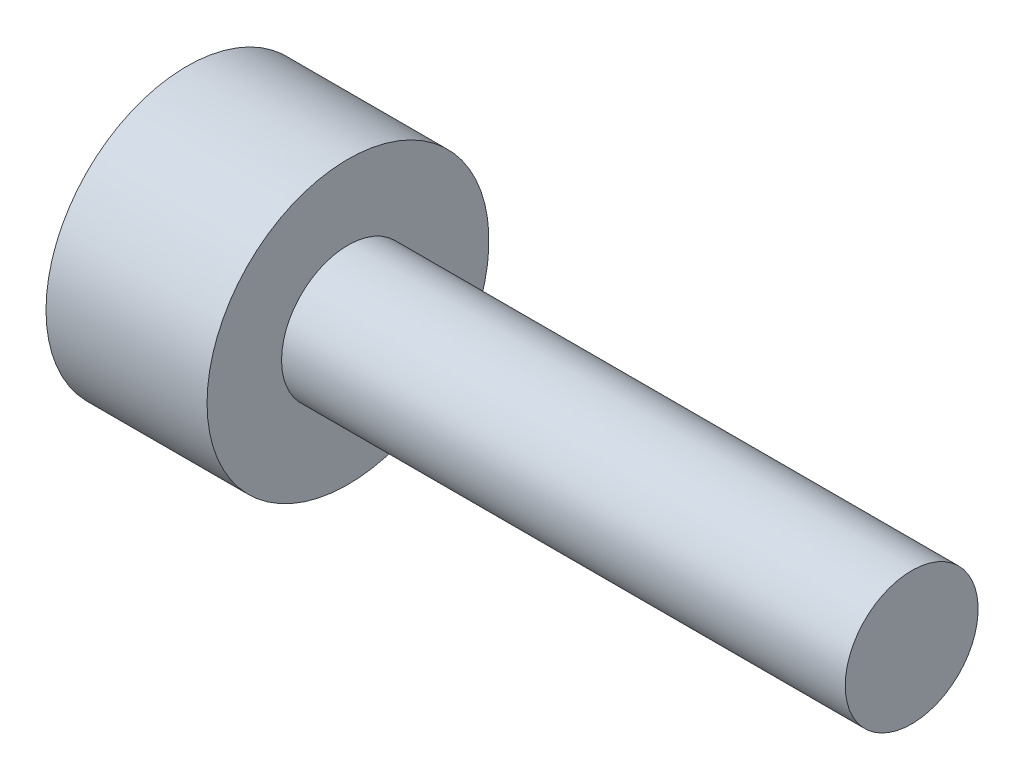
ISO-10303-21;
HEADER;
FILE_DESCRIPTION(('STEP AP214'),'2;1');
FILE_NAME('part.step','',(''),(''),'','','');
FILE_SCHEMA(('AUTOMOTIVE_DESIGN { 1 0 10303 214 1 1 1 1 }'));
ENDSEC;
DATA;
#1=APPLICATION_CONTEXT('core data for automotive mechanical design processes');
#2=APPLICATION_PROTOCOL_DEFINITION('international standard','automotive_design',2000,#1);
#3=PRODUCT_CONTEXT('',#1,'mechanical');
#4=PRODUCT('Part','Part','',(#3));
#5=PRODUCT_RELATED_PRODUCT_CATEGORY('part','',(#4));
#6=PRODUCT_DEFINITION_FORMATION('','',#4);
#7=PRODUCT_DEFINITION_CONTEXT('part definition',#1,'design');
#8=PRODUCT_DEFINITION('design','',#6,#7);
#9=PRODUCT_DEFINITION_SHAPE('','',#8);
#10=(LENGTH_UNIT() NAMED_UNIT(*) SI_UNIT(.MILLI.,.METRE.));
#11=(NAMED_UNIT(*) PLANE_ANGLE_UNIT() SI_UNIT($,.RADIAN.));
#12=(NAMED_UNIT(*) SI_UNIT($,.STERADIAN.) SOLID_ANGLE_UNIT());
#13=UNCERTAINTY_MEASURE_WITH_UNIT(LENGTH_MEASURE(1.E-05),#10,'distance_accuracy_value','');
#14=(GEOMETRIC_REPRESENTATION_CONTEXT(3) GLOBAL_UNCERTAINTY_ASSIGNED_CONTEXT((#13)) GLOBAL_UNIT_ASSIGNED_CONTEXT((#10,
#11,#12)) REPRESENTATION_CONTEXT('',''));
#15=CARTESIAN_POINT('',(0.,0.,0.));
#16=DIRECTION('',(0.,0.,1.));
#17=DIRECTION('',(1.,0.,0.));
#18=AXIS2_PLACEMENT_3D('',#15,#16,#17);
#19=CARTESIAN_POINT('',(-4.,0.,0.));
#20=DIRECTION('',(1.,0.,0.));
#21=DIRECTION('',(0.,0.,-1.));
#22=AXIS2_PLACEMENT_3D('',#19,#20,#21);
#23=PLANE('',#22);
#24=CARTESIAN_POINT('',(-4.,0.,0.));
#25=DIRECTION('',(-1.,0.,0.));
#26=DIRECTION('',(0.,0.,1.));
#27=AXIS2_PLACEMENT_3D('',#24,#25,#26);
#28=CIRCLE('',#27,3.5);
#29=CARTESIAN_POINT('',(-4.,0.,3.5));
#30=VERTEX_POINT('',#29);
#31=EDGE_CURVE('E11',#30,#30,#28,.T.);
#32=ORIENTED_EDGE('',*,*,#31,.T.);
#33=EDGE_LOOP('',(#32));
#34=FACE_BOUND('',#33,.T.);
#35=DIRECTION('',(0.,0.866025403784439,-0.5));
#36=VECTOR('',#35,1.);
#37=CARTESIAN_POINT('',(-4.,-1.5,-0.866025403784439));
#38=LINE('',#37,#36);
#39=CARTESIAN_POINT('',(-4.,-1.5,-0.866025403784439));
#40=VERTEX_POINT('',#39);
#41=CARTESIAN_POINT('',(-4.,0.,-1.73205080756888));
#42=VERTEX_POINT('',#41);
#43=EDGE_CURVE('E54',#40,#42,#38,.T.);
#44=ORIENTED_EDGE('',*,*,#43,.T.);
#45=DIRECTION('',(0.,0.866025403784439,0.5));
#46=VECTOR('',#45,1.);
#47=CARTESIAN_POINT('',(-4.,0.,-1.73205080756888));
#48=LINE('',#47,#46);
#49=CARTESIAN_POINT('',(-4.,1.5,-0.866025403784439));
#50=VERTEX_POINT('',#49);
#51=EDGE_CURVE('E126',#42,#50,#48,.T.);
#52=ORIENTED_EDGE('',*,*,#51,.T.);
#53=DIRECTION('',(0.,0.,1.));
#54=VECTOR('',#53,1.);
#55=CARTESIAN_POINT('',(-4.,1.5,-0.866025403784439));
#56=LINE('',#55,#54);
#57=CARTESIAN_POINT('',(-4.,1.5,0.866025403784438));
#58=VERTEX_POINT('',#57);
#59=EDGE_CURVE('E128',#50,#58,#56,.T.);
#60=ORIENTED_EDGE('',*,*,#59,.T.);
#61=DIRECTION('',(0.,-0.866025403784438,0.5));
#62=VECTOR('',#61,1.);
#63=CARTESIAN_POINT('',(-4.,1.5,0.866025403784438));
#64=LINE('',#63,#62);
#65=CARTESIAN_POINT('',(-4.,0.,1.73205080756888));
#66=VERTEX_POINT('',#65);
#67=EDGE_CURVE('E135',#58,#66,#64,.T.);
#68=ORIENTED_EDGE('',*,*,#67,.T.);
#69=DIRECTION('',(0.,-0.866025403784439,-0.5));
#70=VECTOR('',#69,1.);
#71=CARTESIAN_POINT('',(-4.,0.,1.73205080756888));
#72=LINE('',#71,#70);
#73=CARTESIAN_POINT('',(-4.,-1.5,0.866025403784439));
#74=VERTEX_POINT('',#73);
#75=EDGE_CURVE('E116',#66,#74,#72,.T.);
#76=ORIENTED_EDGE('',*,*,#75,.T.);
#77=DIRECTION('',(0.,0.,-1.));
#78=VECTOR('',#77,1.);
#79=CARTESIAN_POINT('',(-4.,-1.5,0.866025403784439));
#80=LINE('',#79,#78);
#81=EDGE_CURVE('E133',#74,#40,#80,.T.);
#82=ORIENTED_EDGE('',*,*,#81,.T.);
#83=EDGE_LOOP('',(#44,#52,#60,#68,#76,#82));
#84=FACE_BOUND('',#83,.T.);
#85=ADVANCED_FACE('F41',(#34,#84),#23,.F.);
#86=CARTESIAN_POINT('',(-1000.,0.,0.));
#87=DIRECTION('',(-1.,0.,0.));
#88=DIRECTION('',(0.,0.,1.));
#89=AXIS2_PLACEMENT_3D('',#86,#87,#88);
#90=CYLINDRICAL_SURFACE('',#89,3.5);
#91=ORIENTED_EDGE('',*,*,#31,.F.);
#92=EDGE_LOOP('',(#91));
#93=FACE_BOUND('',#92,.T.);
#94=CARTESIAN_POINT('',(0.,0.,0.));
#95=DIRECTION('',(-1.,0.,0.));
#96=DIRECTION('',(0.,0.,1.));
#97=AXIS2_PLACEMENT_3D('',#94,#95,#96);
#98=CIRCLE('',#97,3.5);
#99=CARTESIAN_POINT('',(0.,0.,3.5));
#100=VERTEX_POINT('',#99);
#101=EDGE_CURVE('E48',#100,#100,#98,.T.);
#102=ORIENTED_EDGE('',*,*,#101,.T.);
#103=EDGE_LOOP('',(#102));
#104=FACE_BOUND('',#103,.T.);
#105=ADVANCED_FACE('F151',(#93,#104),#90,.T.);
#106=CARTESIAN_POINT('',(0.,3.5,0.));
#107=DIRECTION('',(-1.,0.,0.));
#108=DIRECTION('',(0.,0.,1.));
#109=AXIS2_PLACEMENT_3D('',#106,#107,#108);
#110=PLANE('',#109);
#111=ORIENTED_EDGE('',*,*,#101,.F.);
#112=EDGE_LOOP('',(#111));
#113=FACE_BOUND('',#112,.T.);
#114=CARTESIAN_POINT('',(0.,0.,0.));
#115=DIRECTION('',(-1.,0.,0.));
#116=DIRECTION('',(0.,0.,1.));
#117=AXIS2_PLACEMENT_3D('',#114,#115,#116);
#118=CIRCLE('',#117,1.65);
#119=CARTESIAN_POINT('',(0.,0.,1.65));
#120=VERTEX_POINT('',#119);
#121=EDGE_CURVE('E148',#120,#120,#118,.T.);
#122=ORIENTED_EDGE('',*,*,#121,.T.);
#123=EDGE_LOOP('',(#122));
#124=FACE_BOUND('',#123,.T.);
#125=ADVANCED_FACE('F156',(#113,#124),#110,.F.);
#126=CARTESIAN_POINT('',(-1000.,0.,0.));
#127=DIRECTION('',(-1.,0.,0.));
#128=DIRECTION('',(0.,0.,1.));
#129=AXIS2_PLACEMENT_3D('',#126,#127,#128);
#130=CYLINDRICAL_SURFACE('',#129,1.65);
#131=ORIENTED_EDGE('',*,*,#121,.F.);
#132=EDGE_LOOP('',(#131));
#133=FACE_BOUND('',#132,.T.);
#134=CARTESIAN_POINT('',(14.,0.,0.));
#135=DIRECTION('',(-1.,0.,0.));
#136=DIRECTION('',(0.,0.,1.));
#137=AXIS2_PLACEMENT_3D('',#134,#135,#136);
#138=CIRCLE('',#137,1.65);
#139=CARTESIAN_POINT('',(14.,0.,1.65));
#140=VERTEX_POINT('',#139);
#141=EDGE_CURVE('E146',#140,#140,#138,.T.);
#142=ORIENTED_EDGE('',*,*,#141,.T.);
#143=EDGE_LOOP('',(#142));
#144=FACE_BOUND('',#143,.T.);
#145=ADVANCED_FACE('F158',(#133,#144),#130,.T.);
#146=CARTESIAN_POINT('',(14.,1.65,0.));
#147=DIRECTION('',(-1.,0.,0.));
#148=DIRECTION('',(0.,0.,1.));
#149=AXIS2_PLACEMENT_3D('',#146,#147,#148);
#150=PLANE('',#149);
#151=ORIENTED_EDGE('',*,*,#141,.F.);
#152=EDGE_LOOP('',(#151));
#153=FACE_BOUND('',#152,.T.);
#154=ADVANCED_FACE('F164',(#153),#150,.F.);
#155=CARTESIAN_POINT('',(-2.,-1.5,-0.866025403784439));
#156=DIRECTION('',(0.,0.5,0.866025403784439));
#157=DIRECTION('',(0.,-0.866025403784439,0.5));
#158=AXIS2_PLACEMENT_3D('',#155,#156,#157);
#159=PLANE('',#158);
#160=ORIENTED_EDGE('',*,*,#43,.F.);
#161=DIRECTION('',(-1.,0.,0.));
#162=VECTOR('',#161,1.);
#163=CARTESIAN_POINT('',(-2.,-1.5,-0.866025403784439));
#164=LINE('',#163,#162);
#165=CARTESIAN_POINT('',(-2.,-1.5,-0.866025403784439));
#166=VERTEX_POINT('',#165);
#167=EDGE_CURVE('E122',#166,#40,#164,.T.);
#168=ORIENTED_EDGE('',*,*,#167,.F.);
#169=DIRECTION('',(0.,0.866025403784439,-0.5));
#170=VECTOR('',#169,1.);
#171=CARTESIAN_POINT('',(-2.,-1.5,-0.866025403784439));
#172=LINE('',#171,#170);
#173=CARTESIAN_POINT('',(-2.,0.,-1.73205080756888));
#174=VERTEX_POINT('',#173);
#175=EDGE_CURVE('E137',#166,#174,#172,.T.);
#176=ORIENTED_EDGE('',*,*,#175,.T.);
#177=DIRECTION('',(-1.,0.,0.));
#178=VECTOR('',#177,1.);
#179=CARTESIAN_POINT('',(-2.,0.,-1.73205080756888));
#180=LINE('',#179,#178);
#181=EDGE_CURVE('E144',#174,#42,#180,.T.);
#182=ORIENTED_EDGE('',*,*,#181,.T.);
#183=EDGE_LOOP('',(#160,#168,#176,#182));
#184=FACE_BOUND('',#183,.T.);
#185=ADVANCED_FACE('F167',(#184),#159,.T.);
#186=CARTESIAN_POINT('',(-2.,0.,-1.73205080756888));
#187=DIRECTION('',(0.,-0.5,0.866025403784439));
#188=DIRECTION('',(0.,-0.866025403784439,-0.5));
#189=AXIS2_PLACEMENT_3D('',#186,#187,#188);
#190=PLANE('',#189);
#191=ORIENTED_EDGE('',*,*,#51,.F.);
#192=ORIENTED_EDGE('',*,*,#181,.F.);
#193=DIRECTION('',(0.,0.866025403784439,0.5));
#194=VECTOR('',#193,1.);
#195=CARTESIAN_POINT('',(-2.,0.,-1.73205080756888));
#196=LINE('',#195,#194);
#197=CARTESIAN_POINT('',(-2.,1.5,-0.866025403784439));
#198=VERTEX_POINT('',#197);
#199=EDGE_CURVE('E93',#174,#198,#196,.T.);
#200=ORIENTED_EDGE('',*,*,#199,.T.);
#201=DIRECTION('',(-1.,0.,0.));
#202=VECTOR('',#201,1.);
#203=CARTESIAN_POINT('',(-2.,1.5,-0.866025403784439));
#204=LINE('',#203,#202);
#205=EDGE_CURVE('E145',#198,#50,#204,.T.);
#206=ORIENTED_EDGE('',*,*,#205,.T.);
#207=EDGE_LOOP('',(#191,#192,#200,#206));
#208=FACE_BOUND('',#207,.T.);
#209=ADVANCED_FACE('F176',(#208),#190,.T.);
#210=CARTESIAN_POINT('',(-2.,1.5,-0.866025403784439));
#211=DIRECTION('',(0.,-1.,0.));
#212=DIRECTION('',(0.,0.,-1.));
#213=AXIS2_PLACEMENT_3D('',#210,#211,#212);
#214=PLANE('',#213);
#215=ORIENTED_EDGE('',*,*,#59,.F.);
#216=ORIENTED_EDGE('',*,*,#205,.F.);
#217=DIRECTION('',(0.,0.,1.));
#218=VECTOR('',#217,1.);
#219=CARTESIAN_POINT('',(-2.,1.5,-0.866025403784439));
#220=LINE('',#219,#218);
#221=CARTESIAN_POINT('',(-2.,1.5,0.866025403784438));
#222=VERTEX_POINT('',#221);
#223=EDGE_CURVE('E115',#198,#222,#220,.T.);
#224=ORIENTED_EDGE('',*,*,#223,.T.);
#225=DIRECTION('',(-1.,0.,0.));
#226=VECTOR('',#225,1.);
#227=CARTESIAN_POINT('',(-2.,1.5,0.866025403784438));
#228=LINE('',#227,#226);
#229=EDGE_CURVE('E107',#222,#58,#228,.T.);
#230=ORIENTED_EDGE('',*,*,#229,.T.);
#231=EDGE_LOOP('',(#215,#216,#224,#230));
#232=FACE_BOUND('',#231,.T.);
#233=ADVANCED_FACE('F195',(#232),#214,.T.);
#234=CARTESIAN_POINT('',(-2.,1.5,0.866025403784438));
#235=DIRECTION('',(0.,-0.5,-0.866025403784439));
#236=DIRECTION('',(0.,0.866025403784438,-0.5));
#237=AXIS2_PLACEMENT_3D('',#234,#235,#236);
#238=PLANE('',#237);
#239=ORIENTED_EDGE('',*,*,#67,.F.);
#240=ORIENTED_EDGE('',*,*,#229,.F.);
#241=DIRECTION('',(0.,-0.866025403784438,0.5));
#242=VECTOR('',#241,1.);
#243=CARTESIAN_POINT('',(-2.,1.5,0.866025403784438));
#244=LINE('',#243,#242);
#245=CARTESIAN_POINT('',(-2.,0.,1.73205080756888));
#246=VERTEX_POINT('',#245);
#247=EDGE_CURVE('E104',#222,#246,#244,.T.);
#248=ORIENTED_EDGE('',*,*,#247,.T.);
#249=DIRECTION('',(-1.,0.,0.));
#250=VECTOR('',#249,1.);
#251=CARTESIAN_POINT('',(-2.,0.,1.73205080756888));
#252=LINE('',#251,#250);
#253=EDGE_CURVE('E108',#246,#66,#252,.T.);
#254=ORIENTED_EDGE('',*,*,#253,.T.);
#255=EDGE_LOOP('',(#239,#240,#248,#254));
#256=FACE_BOUND('',#255,.T.);
#257=ADVANCED_FACE('F110',(#256),#238,.T.);
#258=CARTESIAN_POINT('',(-2.,0.,1.73205080756888));
#259=DIRECTION('',(0.,0.5,-0.866025403784439));
#260=DIRECTION('',(0.,0.866025403784439,0.5));
#261=AXIS2_PLACEMENT_3D('',#258,#259,#260);
#262=PLANE('',#261);
#263=ORIENTED_EDGE('',*,*,#75,.F.);
#264=ORIENTED_EDGE('',*,*,#253,.F.);
#265=DIRECTION('',(0.,-0.866025403784439,-0.5));
#266=VECTOR('',#265,1.);
#267=CARTESIAN_POINT('',(-2.,0.,1.73205080756888));
#268=LINE('',#267,#266);
#269=CARTESIAN_POINT('',(-2.,-1.5,0.866025403784439));
#270=VERTEX_POINT('',#269);
#271=EDGE_CURVE('E111',#246,#270,#268,.T.);
#272=ORIENTED_EDGE('',*,*,#271,.T.);
#273=DIRECTION('',(-1.,0.,0.));
#274=VECTOR('',#273,1.);
#275=CARTESIAN_POINT('',(-2.,-1.5,0.866025403784439));
#276=LINE('',#275,#274);
#277=EDGE_CURVE('E84',#270,#74,#276,.T.);
#278=ORIENTED_EDGE('',*,*,#277,.T.);
#279=EDGE_LOOP('',(#263,#264,#272,#278));
#280=FACE_BOUND('',#279,.T.);
#281=ADVANCED_FACE('F112',(#280),#262,.T.);
#282=CARTESIAN_POINT('',(-2.,-1.5,0.866025403784439));
#283=DIRECTION('',(0.,1.,0.));
#284=DIRECTION('',(0.,0.,1.));
#285=AXIS2_PLACEMENT_3D('',#282,#283,#284);
#286=PLANE('',#285);
#287=ORIENTED_EDGE('',*,*,#81,.F.);
#288=ORIENTED_EDGE('',*,*,#277,.F.);
#289=DIRECTION('',(0.,0.,-1.));
#290=VECTOR('',#289,1.);
#291=CARTESIAN_POINT('',(-2.,-1.5,0.866025403784439));
#292=LINE('',#291,#290);
#293=EDGE_CURVE('E62',#270,#166,#292,.T.);
#294=ORIENTED_EDGE('',*,*,#293,.T.);
#295=ORIENTED_EDGE('',*,*,#167,.T.);
#296=EDGE_LOOP('',(#287,#288,#294,#295));
#297=FACE_BOUND('',#296,.T.);
#298=ADVANCED_FACE('F184',(#297),#286,.T.);
#299=CARTESIAN_POINT('',(-2.,0.,0.));
#300=DIRECTION('',(1.,0.,0.));
#301=DIRECTION('',(0.,0.,-1.));
#302=AXIS2_PLACEMENT_3D('',#299,#300,#301);
#303=PLANE('',#302);
#304=ORIENTED_EDGE('',*,*,#175,.F.);
#305=ORIENTED_EDGE('',*,*,#293,.F.);
#306=ORIENTED_EDGE('',*,*,#271,.F.);
#307=ORIENTED_EDGE('',*,*,#247,.F.);
#308=ORIENTED_EDGE('',*,*,#223,.F.);
#309=ORIENTED_EDGE('',*,*,#199,.F.);
#310=EDGE_LOOP('',(#304,#305,#306,#307,#308,#309));
#311=FACE_BOUND('',#310,.T.);
#312=ADVANCED_FACE('F118',(#311),#303,.F.);
#313=CLOSED_SHELL('',(#85,#105,#125,#145,#154,#185,#209,#233,#257,#281,#298,#312));
#314=MANIFOLD_SOLID_BREP('B2',#313);
#315=ADVANCED_BREP_SHAPE_REPRESENTATION('',(#18,#314),#14);
#316=SHAPE_DEFINITION_REPRESENTATION(#9,#315);
ENDSEC;
END-ISO-10303-21;
